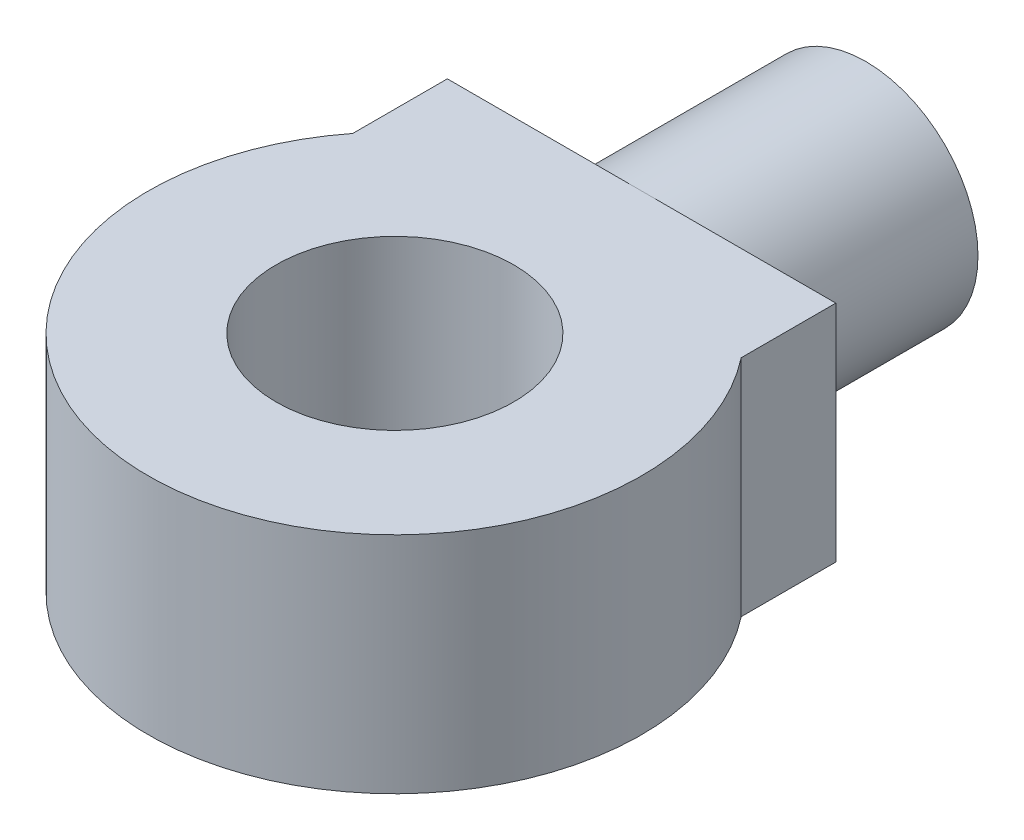
ISO-10303-21;
HEADER;
FILE_DESCRIPTION(('STEP AP214'),'2;1');
FILE_NAME('part.step','',(''),(''),'','','');
FILE_SCHEMA(('AUTOMOTIVE_DESIGN { 1 0 10303 214 1 1 1 1 }'));
ENDSEC;
DATA;
#1=APPLICATION_CONTEXT('core data for automotive mechanical design processes');
#2=APPLICATION_PROTOCOL_DEFINITION('international standard','automotive_design',2000,#1);
#3=PRODUCT_CONTEXT('',#1,'mechanical');
#4=PRODUCT('Part','Part','',(#3));
#5=PRODUCT_RELATED_PRODUCT_CATEGORY('part','',(#4));
#6=PRODUCT_DEFINITION_FORMATION('','',#4);
#7=PRODUCT_DEFINITION_CONTEXT('part definition',#1,'design');
#8=PRODUCT_DEFINITION('design','',#6,#7);
#9=PRODUCT_DEFINITION_SHAPE('','',#8);
#10=(LENGTH_UNIT() NAMED_UNIT(*) SI_UNIT(.MILLI.,.METRE.));
#11=(NAMED_UNIT(*) PLANE_ANGLE_UNIT() SI_UNIT($,.RADIAN.));
#12=(NAMED_UNIT(*) SI_UNIT($,.STERADIAN.) SOLID_ANGLE_UNIT());
#13=UNCERTAINTY_MEASURE_WITH_UNIT(LENGTH_MEASURE(1.E-05),#10,'distance_accuracy_value','');
#14=(GEOMETRIC_REPRESENTATION_CONTEXT(3) GLOBAL_UNCERTAINTY_ASSIGNED_CONTEXT((#13)) GLOBAL_UNIT_ASSIGNED_CONTEXT((#10,
#11,#12)) REPRESENTATION_CONTEXT('',''));
#15=CARTESIAN_POINT('',(0.,0.,0.));
#16=DIRECTION('',(0.,0.,1.));
#17=DIRECTION('',(1.,0.,0.));
#18=AXIS2_PLACEMENT_3D('',#15,#16,#17);
#19=CARTESIAN_POINT('',(0.00480947161671241,-0.00484590396801488,-10.5038153233316));
#20=DIRECTION('',(0.,0.,1.));
#21=DIRECTION('',(1.,0.,0.));
#22=AXIS2_PLACEMENT_3D('',#19,#20,#21);
#23=CYLINDRICAL_SURFACE('',#22,2.5);
#24=CARTESIAN_POINT('',(0.00480947161671241,-0.00484590396801488,-10.5038153233316));
#25=DIRECTION('',(0.,0.,1.));
#26=DIRECTION('',(1.,0.,0.));
#27=AXIS2_PLACEMENT_3D('',#24,#25,#26);
#28=CIRCLE('',#27,2.5);
#29=CARTESIAN_POINT('',(2.50480947161671,-0.00484590396801488,-10.5038153233316));
#30=VERTEX_POINT('',#29);
#31=EDGE_CURVE('E11',#30,#30,#28,.T.);
#32=ORIENTED_EDGE('',*,*,#31,.T.);
#33=EDGE_LOOP('',(#32));
#34=FACE_BOUND('',#33,.T.);
#35=CARTESIAN_POINT('',(0.00480947161671241,-0.00484590396801488,-5.50381532333162));
#36=DIRECTION('',(0.,0.,1.));
#37=DIRECTION('',(1.,0.,0.));
#38=AXIS2_PLACEMENT_3D('',#35,#36,#37);
#39=CIRCLE('',#38,2.5);
#40=CARTESIAN_POINT('',(0.00480947161671241,2.49515409603199,-5.50381532333162));
#41=VERTEX_POINT('',#40);
#42=CARTESIAN_POINT('',(0.00480947161671241,-2.50484590396802,-5.50381532333162));
#43=VERTEX_POINT('',#42);
#44=EDGE_CURVE('E42',#41,#43,#39,.T.);
#45=ORIENTED_EDGE('',*,*,#44,.F.);
#46=EDGE_CURVE('E93',#43,#41,#39,.T.);
#47=ORIENTED_EDGE('',*,*,#46,.F.);
#48=EDGE_LOOP('',(#45,#47));
#49=FACE_BOUND('',#48,.T.);
#50=ADVANCED_FACE('F39',(#34,#49),#23,.T.);
#51=CARTESIAN_POINT('',(0.00480947161671241,-0.00484590396801488,-10.5038153233316));
#52=DIRECTION('',(0.,0.,1.));
#53=DIRECTION('',(1.,0.,0.));
#54=AXIS2_PLACEMENT_3D('',#51,#52,#53);
#55=PLANE('',#54);
#56=ORIENTED_EDGE('',*,*,#31,.F.);
#57=EDGE_LOOP('',(#56));
#58=FACE_BOUND('',#57,.T.);
#59=ADVANCED_FACE('F178',(#58),#55,.F.);
#60=CARTESIAN_POINT('',(-21.,-129.32,-5.50381532333162));
#61=DIRECTION('',(0.,0.,1.));
#62=DIRECTION('',(1.,0.,0.));
#63=AXIS2_PLACEMENT_3D('',#60,#61,#62);
#64=PLANE('',#63);
#65=DIRECTION('',(-1.,0.,0.));
#66=VECTOR('',#65,1.);
#67=CARTESIAN_POINT('',(-4.32531754730548,2.49515409603199,-5.50381532333162));
#68=LINE('',#67,#66);
#69=CARTESIAN_POINT('',(-4.32531754730548,2.49515409603199,-5.50381532333162));
#70=VERTEX_POINT('',#69);
#71=EDGE_CURVE('E122',#41,#70,#68,.T.);
#72=ORIENTED_EDGE('',*,*,#71,.F.);
#73=ORIENTED_EDGE('',*,*,#44,.T.);
#74=DIRECTION('',(1.,0.,0.));
#75=VECTOR('',#74,1.);
#76=CARTESIAN_POINT('',(-4.32531754730548,-2.50484590396802,-5.50381532333162));
#77=LINE('',#76,#75);
#78=CARTESIAN_POINT('',(-4.32531754730548,-2.50484590396802,-5.50381532333162));
#79=VERTEX_POINT('',#78);
#80=EDGE_CURVE('E89',#79,#43,#77,.T.);
#81=ORIENTED_EDGE('',*,*,#80,.F.);
#82=DIRECTION('',(0.,-1.,0.));
#83=VECTOR('',#82,1.);
#84=CARTESIAN_POINT('',(-4.32531754730548,2.49515409603199,-5.50381532333162));
#85=LINE('',#84,#83);
#86=EDGE_CURVE('E101',#70,#79,#85,.T.);
#87=ORIENTED_EDGE('',*,*,#86,.F.);
#88=EDGE_LOOP('',(#72,#73,#81,#87));
#89=FACE_BOUND('',#88,.T.);
#90=ADVANCED_FACE('F100',(#89),#64,.F.);
#91=CARTESIAN_POINT('',(4.33493649053891,-2.50484590396802,-5.50381532333162));
#92=VERTEX_POINT('',#91);
#93=EDGE_CURVE('E105',#43,#92,#77,.T.);
#94=ORIENTED_EDGE('',*,*,#93,.F.);
#95=ORIENTED_EDGE('',*,*,#46,.T.);
#96=CARTESIAN_POINT('',(4.33493649053891,2.49515409603199,-5.50381532333162));
#97=VERTEX_POINT('',#96);
#98=EDGE_CURVE('E123',#97,#41,#68,.T.);
#99=ORIENTED_EDGE('',*,*,#98,.F.);
#100=DIRECTION('',(0.,1.,0.));
#101=VECTOR('',#100,1.);
#102=CARTESIAN_POINT('',(4.33493649053891,2.49515409603199,-5.50381532333162));
#103=LINE('',#102,#101);
#104=EDGE_CURVE('E104',#92,#97,#103,.T.);
#105=ORIENTED_EDGE('',*,*,#104,.F.);
#106=EDGE_LOOP('',(#94,#95,#99,#105));
#107=FACE_BOUND('',#106,.T.);
#108=ADVANCED_FACE('F138',(#107),#64,.F.);
#109=CARTESIAN_POINT('',(-4.32531754730548,2.49515409603199,-0.503815323331623));
#110=DIRECTION('',(1.,0.,0.));
#111=DIRECTION('',(0.,0.,-1.));
#112=AXIS2_PLACEMENT_3D('',#109,#110,#111);
#113=PLANE('',#112);
#114=DIRECTION('',(0.,0.,-1.));
#115=VECTOR('',#114,1.);
#116=CARTESIAN_POINT('',(-4.32531754730548,-2.50484590396802,-0.503815323331623));
#117=LINE('',#116,#115);
#118=CARTESIAN_POINT('',(-4.32531754730548,-2.50484590396802,-3.39498031489425));
#119=VERTEX_POINT('',#118);
#120=EDGE_CURVE('E54',#119,#79,#117,.T.);
#121=ORIENTED_EDGE('',*,*,#120,.F.);
#122=DIRECTION('',(0.,1.,0.));
#123=VECTOR('',#122,1.);
#124=CARTESIAN_POINT('',(-4.32531754730548,-18.0611950900721,-3.39498031489425));
#125=LINE('',#124,#123);
#126=CARTESIAN_POINT('',(-4.32531754730548,2.49515409603199,-3.39498031489425));
#127=VERTEX_POINT('',#126);
#128=EDGE_CURVE('E112',#119,#127,#125,.T.);
#129=ORIENTED_EDGE('',*,*,#128,.T.);
#130=DIRECTION('',(0.,0.,-1.));
#131=VECTOR('',#130,1.);
#132=CARTESIAN_POINT('',(-4.32531754730548,2.49515409603199,-0.503815323331623));
#133=LINE('',#132,#131);
#134=EDGE_CURVE('E109',#127,#70,#133,.T.);
#135=ORIENTED_EDGE('',*,*,#134,.T.);
#136=ORIENTED_EDGE('',*,*,#86,.T.);
#137=EDGE_LOOP('',(#121,#129,#135,#136));
#138=FACE_BOUND('',#137,.T.);
#139=ADVANCED_FACE('F107',(#138),#113,.F.);
#140=CARTESIAN_POINT('',(-4.32531754730548,-2.50484590396802,-0.503815323331623));
#141=DIRECTION('',(0.,1.,0.));
#142=DIRECTION('',(0.,0.,1.));
#143=AXIS2_PLACEMENT_3D('',#140,#141,#142);
#144=PLANE('',#143);
#145=CARTESIAN_POINT('',(0.00480947161671241,-2.50484590396802,-0.00381532333162266));
#146=DIRECTION('',(0.,1.,0.));
#147=DIRECTION('',(0.,0.,1.));
#148=AXIS2_PLACEMENT_3D('',#145,#146,#147);
#149=CIRCLE('',#148,2.65);
#150=CARTESIAN_POINT('',(0.00480947161671241,-2.50484590396802,2.64618467666838));
#151=VERTEX_POINT('',#150);
#152=EDGE_CURVE('E152',#151,#151,#149,.T.);
#153=ORIENTED_EDGE('',*,*,#152,.T.);
#154=EDGE_LOOP('',(#153));
#155=FACE_BOUND('',#154,.T.);
#156=CARTESIAN_POINT('',(0.00480947161671241,-2.50484590396802,-0.00381532333162266));
#157=DIRECTION('',(0.,1.,0.));
#158=DIRECTION('',(0.,0.,1.));
#159=AXIS2_PLACEMENT_3D('',#156,#157,#158);
#160=CIRCLE('',#159,5.5);
#161=CARTESIAN_POINT('',(4.33493649053891,-2.50484590396802,-3.39498031489425));
#162=VERTEX_POINT('',#161);
#163=EDGE_CURVE('E91',#162,#119,#160,.F.);
#164=ORIENTED_EDGE('',*,*,#163,.T.);
#165=ORIENTED_EDGE('',*,*,#120,.T.);
#166=ORIENTED_EDGE('',*,*,#80,.T.);
#167=ORIENTED_EDGE('',*,*,#93,.T.);
#168=DIRECTION('',(0.,0.,-1.));
#169=VECTOR('',#168,1.);
#170=CARTESIAN_POINT('',(4.33493649053891,-2.50484590396802,-0.503815323331623));
#171=LINE('',#170,#169);
#172=EDGE_CURVE('E94',#162,#92,#171,.T.);
#173=ORIENTED_EDGE('',*,*,#172,.F.);
#174=EDGE_LOOP('',(#164,#165,#166,#167,#173));
#175=FACE_BOUND('',#174,.T.);
#176=ADVANCED_FACE('F87',(#155,#175),#144,.F.);
#177=CARTESIAN_POINT('',(4.33493649053891,2.49515409603199,-0.503815323331623));
#178=DIRECTION('',(-1.,0.,0.));
#179=DIRECTION('',(0.,0.,1.));
#180=AXIS2_PLACEMENT_3D('',#177,#178,#179);
#181=PLANE('',#180);
#182=DIRECTION('',(0.,0.,-1.));
#183=VECTOR('',#182,1.);
#184=CARTESIAN_POINT('',(4.33493649053891,2.49515409603199,-0.503815323331623));
#185=LINE('',#184,#183);
#186=CARTESIAN_POINT('',(4.33493649053891,2.49515409603199,-3.39498031489425));
#187=VERTEX_POINT('',#186);
#188=EDGE_CURVE('E129',#187,#97,#185,.T.);
#189=ORIENTED_EDGE('',*,*,#188,.F.);
#190=DIRECTION('',(0.,1.,0.));
#191=VECTOR('',#190,1.);
#192=CARTESIAN_POINT('',(4.33493649053891,-18.0611950900721,-3.39498031489425));
#193=LINE('',#192,#191);
#194=EDGE_CURVE('E62',#187,#162,#193,.F.);
#195=ORIENTED_EDGE('',*,*,#194,.T.);
#196=ORIENTED_EDGE('',*,*,#172,.T.);
#197=ORIENTED_EDGE('',*,*,#104,.T.);
#198=EDGE_LOOP('',(#189,#195,#196,#197));
#199=FACE_BOUND('',#198,.T.);
#200=ADVANCED_FACE('F133',(#199),#181,.F.);
#201=CARTESIAN_POINT('',(-4.32531754730548,2.49515409603199,-0.503815323331623));
#202=DIRECTION('',(0.,-1.,0.));
#203=DIRECTION('',(0.,0.,-1.));
#204=AXIS2_PLACEMENT_3D('',#201,#202,#203);
#205=PLANE('',#204);
#206=CARTESIAN_POINT('',(0.00480947161671241,2.49515409603199,-0.00381532333162266));
#207=DIRECTION('',(0.,1.,0.));
#208=DIRECTION('',(0.,0.,1.));
#209=AXIS2_PLACEMENT_3D('',#206,#207,#208);
#210=CIRCLE('',#209,2.65);
#211=CARTESIAN_POINT('',(0.00480947161671241,2.49515409603199,2.64618467666838));
#212=VERTEX_POINT('',#211);
#213=EDGE_CURVE('E153',#212,#212,#210,.T.);
#214=ORIENTED_EDGE('',*,*,#213,.F.);
#215=EDGE_LOOP('',(#214));
#216=FACE_BOUND('',#215,.T.);
#217=ORIENTED_EDGE('',*,*,#134,.F.);
#218=CARTESIAN_POINT('',(0.00480947161671241,2.49515409603199,-0.00381532333162266));
#219=DIRECTION('',(0.,1.,0.));
#220=DIRECTION('',(0.,0.,1.));
#221=AXIS2_PLACEMENT_3D('',#218,#219,#220);
#222=CIRCLE('',#221,5.5);
#223=EDGE_CURVE('E143',#127,#187,#222,.T.);
#224=ORIENTED_EDGE('',*,*,#223,.T.);
#225=ORIENTED_EDGE('',*,*,#188,.T.);
#226=ORIENTED_EDGE('',*,*,#98,.T.);
#227=ORIENTED_EDGE('',*,*,#71,.T.);
#228=EDGE_LOOP('',(#217,#224,#225,#226,#227));
#229=FACE_BOUND('',#228,.T.);
#230=ADVANCED_FACE('F140',(#216,#229),#205,.F.);
#231=CARTESIAN_POINT('',(0.00480947161671241,-18.0611950900721,-0.00381532333162266));
#232=DIRECTION('',(0.,1.,0.));
#233=DIRECTION('',(0.,0.,1.));
#234=AXIS2_PLACEMENT_3D('',#231,#232,#233);
#235=CYLINDRICAL_SURFACE('',#234,5.5);
#236=ORIENTED_EDGE('',*,*,#128,.F.);
#237=ORIENTED_EDGE('',*,*,#163,.F.);
#238=ORIENTED_EDGE('',*,*,#194,.F.);
#239=ORIENTED_EDGE('',*,*,#223,.F.);
#240=EDGE_LOOP('',(#236,#237,#238,#239));
#241=FACE_BOUND('',#240,.T.);
#242=ADVANCED_FACE('F145',(#241),#235,.T.);
#243=CARTESIAN_POINT('',(0.00480947161671241,-2.50484590396802,-0.00381532333162266));
#244=DIRECTION('',(0.,1.,0.));
#245=DIRECTION('',(0.,0.,1.));
#246=AXIS2_PLACEMENT_3D('',#243,#244,#245);
#247=CYLINDRICAL_SURFACE('',#246,2.65);
#248=ORIENTED_EDGE('',*,*,#152,.F.);
#249=EDGE_LOOP('',(#248));
#250=FACE_BOUND('',#249,.T.);
#251=ORIENTED_EDGE('',*,*,#213,.T.);
#252=EDGE_LOOP('',(#251));
#253=FACE_BOUND('',#252,.T.);
#254=ADVANCED_FACE('F162',(#250,#253),#247,.F.);
#255=CLOSED_SHELL('',(#50,#59,#90,#108,#139,#176,#200,#230,#242,#254));
#256=MANIFOLD_SOLID_BREP('B2',#255);
#257=ADVANCED_BREP_SHAPE_REPRESENTATION('',(#18,#256),#14);
#258=SHAPE_DEFINITION_REPRESENTATION(#9,#257);
ENDSEC;
END-ISO-10303-21;
